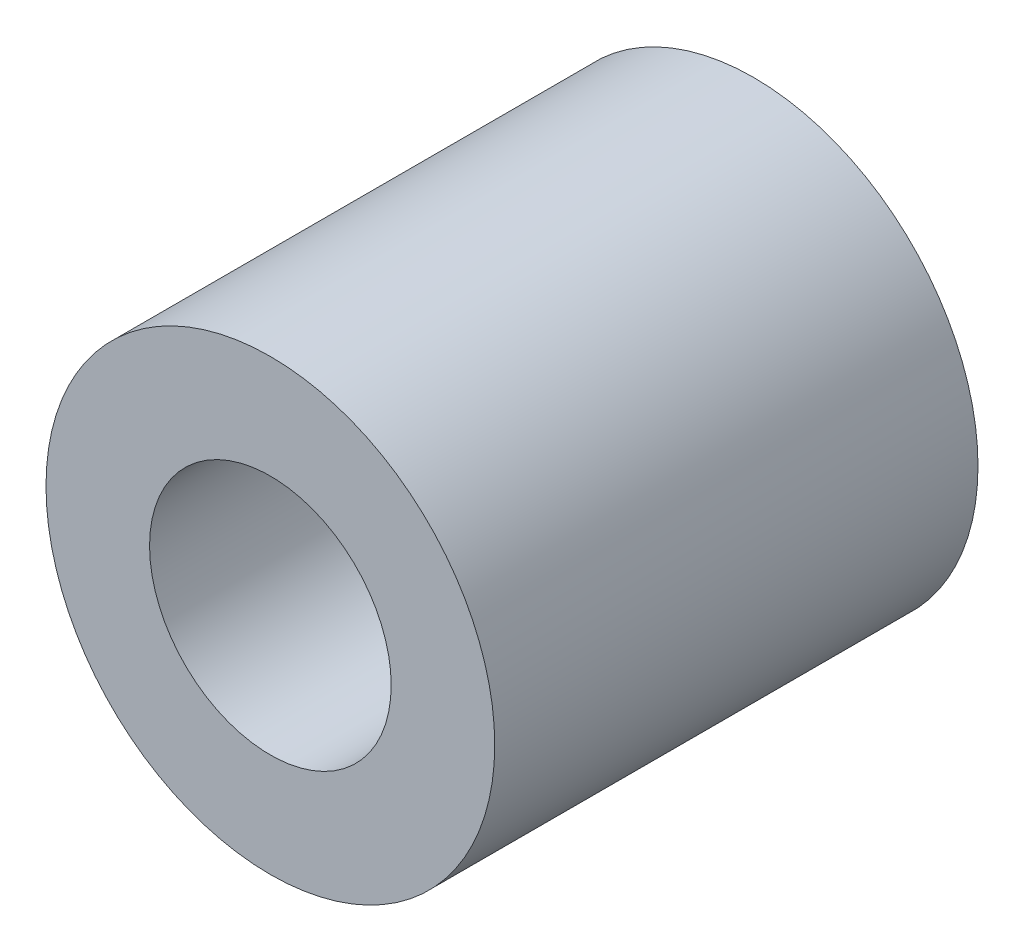
ISO-10303-21;
HEADER;
FILE_DESCRIPTION(('STEP AP214'),'2;1');
FILE_NAME('part.step','',(''),(''),'','','');
FILE_SCHEMA(('AUTOMOTIVE_DESIGN { 1 0 10303 214 1 1 1 1 }'));
ENDSEC;
DATA;
#1=APPLICATION_CONTEXT('core data for automotive mechanical design processes');
#2=APPLICATION_PROTOCOL_DEFINITION('international standard','automotive_design',2000,#1);
#3=PRODUCT_CONTEXT('',#1,'mechanical');
#4=PRODUCT('Part','Part','',(#3));
#5=PRODUCT_RELATED_PRODUCT_CATEGORY('part','',(#4));
#6=PRODUCT_DEFINITION_FORMATION('','',#4);
#7=PRODUCT_DEFINITION_CONTEXT('part definition',#1,'design');
#8=PRODUCT_DEFINITION('design','',#6,#7);
#9=PRODUCT_DEFINITION_SHAPE('','',#8);
#10=(LENGTH_UNIT() NAMED_UNIT(*) SI_UNIT(.MILLI.,.METRE.));
#11=(NAMED_UNIT(*) PLANE_ANGLE_UNIT() SI_UNIT($,.RADIAN.));
#12=(NAMED_UNIT(*) SI_UNIT($,.STERADIAN.) SOLID_ANGLE_UNIT());
#13=UNCERTAINTY_MEASURE_WITH_UNIT(LENGTH_MEASURE(1.E-05),#10,'distance_accuracy_value','');
#14=(GEOMETRIC_REPRESENTATION_CONTEXT(3) GLOBAL_UNCERTAINTY_ASSIGNED_CONTEXT((#13)) GLOBAL_UNIT_ASSIGNED_CONTEXT((#10,
#11,#12)) REPRESENTATION_CONTEXT('',''));
#15=CARTESIAN_POINT('',(0.,0.,0.));
#16=DIRECTION('',(0.,0.,1.));
#17=DIRECTION('',(1.,0.,0.));
#18=AXIS2_PLACEMENT_3D('',#15,#16,#17);
#19=CARTESIAN_POINT('',(0.,0.,7.));
#20=DIRECTION('',(0.,0.,-1.));
#21=DIRECTION('',(-1.,0.,0.));
#22=AXIS2_PLACEMENT_3D('',#19,#20,#21);
#23=CYLINDRICAL_SURFACE('',#22,3.25);
#24=CARTESIAN_POINT('',(0.,0.,7.));
#25=DIRECTION('',(0.,0.,1.));
#26=DIRECTION('',(1.,0.,0.));
#27=AXIS2_PLACEMENT_3D('',#24,#25,#26);
#28=CIRCLE('',#27,3.25);
#29=CARTESIAN_POINT('',(3.25,0.,7.));
#30=VERTEX_POINT('',#29);
#31=EDGE_CURVE('E10',#30,#30,#28,.T.);
#32=ORIENTED_EDGE('',*,*,#31,.F.);
#33=EDGE_LOOP('',(#32));
#34=FACE_BOUND('',#33,.T.);
#35=CARTESIAN_POINT('',(0.,0.,0.));
#36=DIRECTION('',(0.,0.,1.));
#37=DIRECTION('',(1.,0.,0.));
#38=AXIS2_PLACEMENT_3D('',#35,#36,#37);
#39=CIRCLE('',#38,3.25);
#40=CARTESIAN_POINT('',(3.25,0.,0.));
#41=VERTEX_POINT('',#40);
#42=EDGE_CURVE('E40',#41,#41,#39,.T.);
#43=ORIENTED_EDGE('',*,*,#42,.T.);
#44=EDGE_LOOP('',(#43));
#45=FACE_BOUND('',#44,.T.);
#46=ADVANCED_FACE('F37',(#34,#45),#23,.T.);
#47=CARTESIAN_POINT('',(0.,0.,7.));
#48=DIRECTION('',(0.,0.,1.));
#49=DIRECTION('',(1.,0.,0.));
#50=AXIS2_PLACEMENT_3D('',#47,#48,#49);
#51=PLANE('',#50);
#52=CARTESIAN_POINT('',(0.,0.,7.));
#53=DIRECTION('',(0.,0.,-1.));
#54=DIRECTION('',(-1.,0.,0.));
#55=AXIS2_PLACEMENT_3D('',#52,#53,#54);
#56=CIRCLE('',#55,1.75);
#57=CARTESIAN_POINT('',(-1.75,0.,7.));
#58=VERTEX_POINT('',#57);
#59=EDGE_CURVE('E49',#58,#58,#56,.T.);
#60=ORIENTED_EDGE('',*,*,#59,.T.);
#61=EDGE_LOOP('',(#60));
#62=FACE_BOUND('',#61,.T.);
#63=ORIENTED_EDGE('',*,*,#31,.T.);
#64=EDGE_LOOP('',(#63));
#65=FACE_BOUND('',#64,.T.);
#66=ADVANCED_FACE('F59',(#62,#65),#51,.T.);
#67=CARTESIAN_POINT('',(0.,0.,0.));
#68=DIRECTION('',(0.,0.,1.));
#69=DIRECTION('',(1.,0.,0.));
#70=AXIS2_PLACEMENT_3D('',#67,#68,#69);
#71=PLANE('',#70);
#72=CARTESIAN_POINT('',(0.,0.,0.));
#73=DIRECTION('',(0.,0.,-1.));
#74=DIRECTION('',(-1.,0.,0.));
#75=AXIS2_PLACEMENT_3D('',#72,#73,#74);
#76=CIRCLE('',#75,1.75);
#77=CARTESIAN_POINT('',(-1.75,0.,0.));
#78=VERTEX_POINT('',#77);
#79=EDGE_CURVE('E51',#78,#78,#76,.T.);
#80=ORIENTED_EDGE('',*,*,#79,.F.);
#81=EDGE_LOOP('',(#80));
#82=FACE_BOUND('',#81,.T.);
#83=ORIENTED_EDGE('',*,*,#42,.F.);
#84=EDGE_LOOP('',(#83));
#85=FACE_BOUND('',#84,.T.);
#86=ADVANCED_FACE('F64',(#82,#85),#71,.F.);
#87=CARTESIAN_POINT('',(0.,0.,7.));
#88=DIRECTION('',(0.,0.,-1.));
#89=DIRECTION('',(-1.,0.,0.));
#90=AXIS2_PLACEMENT_3D('',#87,#88,#89);
#91=CYLINDRICAL_SURFACE('',#90,1.75);
#92=ORIENTED_EDGE('',*,*,#59,.F.);
#93=EDGE_LOOP('',(#92));
#94=FACE_BOUND('',#93,.T.);
#95=ORIENTED_EDGE('',*,*,#79,.T.);
#96=EDGE_LOOP('',(#95));
#97=FACE_BOUND('',#96,.T.);
#98=ADVANCED_FACE('F61',(#94,#97),#91,.F.);
#99=CLOSED_SHELL('',(#46,#66,#86,#98));
#100=MANIFOLD_SOLID_BREP('B2',#99);
#101=ADVANCED_BREP_SHAPE_REPRESENTATION('',(#18,#100),#14);
#102=SHAPE_DEFINITION_REPRESENTATION(#9,#101);
ENDSEC;
END-ISO-10303-21;
